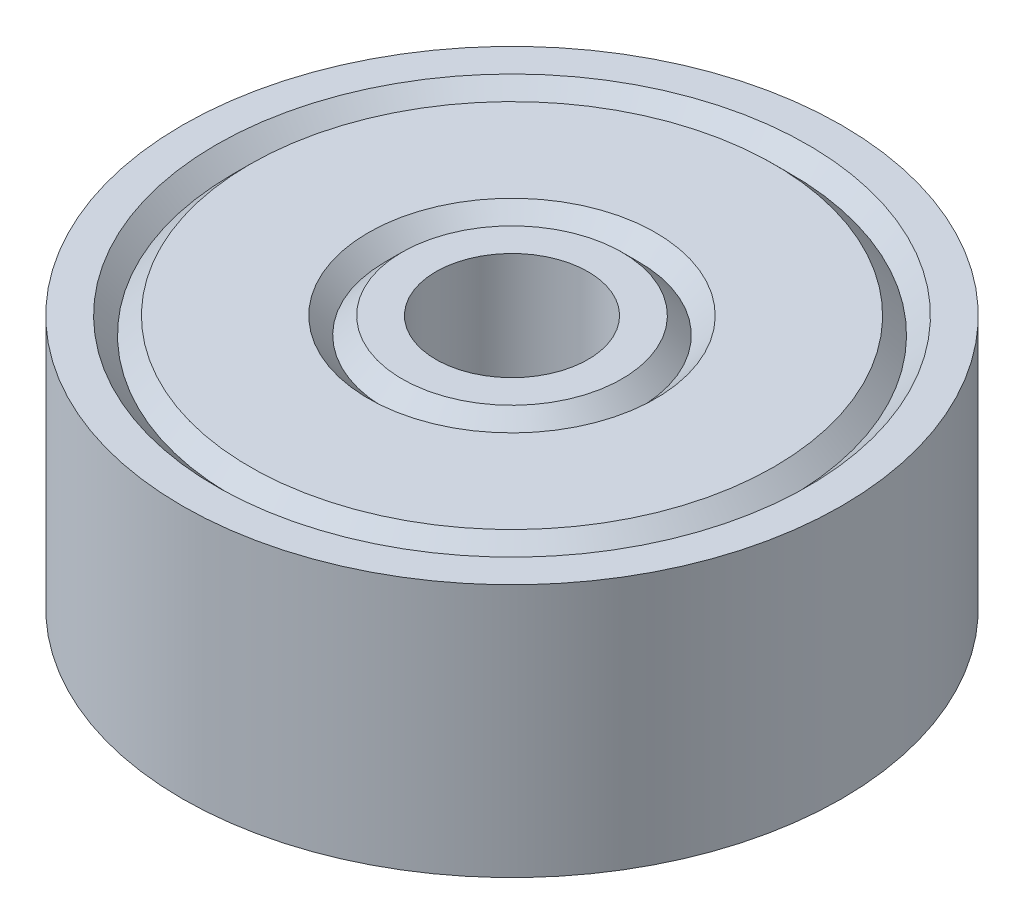
ISO-10303-21;
HEADER;
FILE_DESCRIPTION(('STEP AP214'),'2;1');
FILE_NAME('part.step','',(''),(''),'','','');
FILE_SCHEMA(('AUTOMOTIVE_DESIGN { 1 0 10303 214 1 1 1 1 }'));
ENDSEC;
DATA;
#1=APPLICATION_CONTEXT('core data for automotive mechanical design processes');
#2=APPLICATION_PROTOCOL_DEFINITION('international standard','automotive_design',2000,#1);
#3=PRODUCT_CONTEXT('',#1,'mechanical');
#4=PRODUCT('Part','Part','',(#3));
#5=PRODUCT_RELATED_PRODUCT_CATEGORY('part','',(#4));
#6=PRODUCT_DEFINITION_FORMATION('','',#4);
#7=PRODUCT_DEFINITION_CONTEXT('part definition',#1,'design');
#8=PRODUCT_DEFINITION('design','',#6,#7);
#9=PRODUCT_DEFINITION_SHAPE('','',#8);
#10=(LENGTH_UNIT() NAMED_UNIT(*) SI_UNIT(.MILLI.,.METRE.));
#11=(NAMED_UNIT(*) PLANE_ANGLE_UNIT() SI_UNIT($,.RADIAN.));
#12=(NAMED_UNIT(*) SI_UNIT($,.STERADIAN.) SOLID_ANGLE_UNIT());
#13=UNCERTAINTY_MEASURE_WITH_UNIT(LENGTH_MEASURE(1.E-05),#10,'distance_accuracy_value','');
#14=(GEOMETRIC_REPRESENTATION_CONTEXT(3) GLOBAL_UNCERTAINTY_ASSIGNED_CONTEXT((#13)) GLOBAL_UNIT_ASSIGNED_CONTEXT((#10,
#11,#12)) REPRESENTATION_CONTEXT('',''));
#15=CARTESIAN_POINT('',(0.,0.,0.));
#16=DIRECTION('',(0.,0.,1.));
#17=DIRECTION('',(1.,0.,0.));
#18=AXIS2_PLACEMENT_3D('',#15,#16,#17);
#19=CARTESIAN_POINT('',(0.,2.5,0.));
#20=DIRECTION('',(0.,1.,0.));
#21=DIRECTION('',(-1.,0.,0.));
#22=AXIS2_PLACEMENT_3D('',#19,#20,#21);
#23=CYLINDRICAL_SURFACE('',#22,1.5);
#24=CARTESIAN_POINT('',(0.,2.5,0.));
#25=DIRECTION('',(0.,1.,0.));
#26=DIRECTION('',(-1.,0.,0.));
#27=AXIS2_PLACEMENT_3D('',#24,#25,#26);
#28=CIRCLE('',#27,1.5);
#29=CARTESIAN_POINT('',(-1.5,2.5,0.));
#30=VERTEX_POINT('',#29);
#31=EDGE_CURVE('E83',#30,#30,#28,.T.);
#32=ORIENTED_EDGE('',*,*,#31,.T.);
#33=EDGE_LOOP('',(#32));
#34=FACE_BOUND('',#33,.T.);
#35=CARTESIAN_POINT('',(0.,-2.5,0.));
#36=DIRECTION('',(0.,1.,0.));
#37=DIRECTION('',(-1.,0.,0.));
#38=AXIS2_PLACEMENT_3D('',#35,#36,#37);
#39=CIRCLE('',#38,1.5);
#40=CARTESIAN_POINT('',(-1.5,-2.5,0.));
#41=VERTEX_POINT('',#40);
#42=EDGE_CURVE('E10',#41,#41,#39,.T.);
#43=ORIENTED_EDGE('',*,*,#42,.F.);
#44=EDGE_LOOP('',(#43));
#45=FACE_BOUND('',#44,.T.);
#46=ADVANCED_FACE('F31',(#34,#45),#23,.F.);
#47=CARTESIAN_POINT('',(-1.5,-2.5,0.));
#48=DIRECTION('',(0.,-1.,0.));
#49=DIRECTION('',(1.,0.,0.));
#50=AXIS2_PLACEMENT_3D('',#47,#48,#49);
#51=PLANE('',#50);
#52=ORIENTED_EDGE('',*,*,#42,.T.);
#53=EDGE_LOOP('',(#52));
#54=FACE_BOUND('',#53,.T.);
#55=CARTESIAN_POINT('',(0.,-2.5,0.));
#56=DIRECTION('',(0.,1.,0.));
#57=DIRECTION('',(-1.,0.,0.));
#58=AXIS2_PLACEMENT_3D('',#55,#56,#57);
#59=CIRCLE('',#58,2.16666666666667);
#60=CARTESIAN_POINT('',(-2.16666666666667,-2.5,0.));
#61=VERTEX_POINT('',#60);
#62=EDGE_CURVE('E37',#61,#61,#59,.T.);
#63=ORIENTED_EDGE('',*,*,#62,.F.);
#64=EDGE_LOOP('',(#63));
#65=FACE_BOUND('',#64,.T.);
#66=ADVANCED_FACE('F101',(#54,#65),#51,.T.);
#67=CARTESIAN_POINT('',(0.,-2.16666666666667,0.));
#68=DIRECTION('',(0.,1.,0.));
#69=DIRECTION('',(-1.,0.,0.));
#70=AXIS2_PLACEMENT_3D('',#67,#68,#69);
#71=CONICAL_SURFACE('',#70,2.5,0.785398163397448);
#72=ORIENTED_EDGE('',*,*,#62,.T.);
#73=EDGE_LOOP('',(#72));
#74=FACE_BOUND('',#73,.T.);
#75=CARTESIAN_POINT('',(0.,-2.16666666666667,0.));
#76=DIRECTION('',(0.,1.,0.));
#77=DIRECTION('',(-1.,0.,0.));
#78=AXIS2_PLACEMENT_3D('',#75,#76,#77);
#79=CIRCLE('',#78,2.5);
#80=CARTESIAN_POINT('',(-2.5,-2.16666666666667,0.));
#81=VERTEX_POINT('',#80);
#82=EDGE_CURVE('E41',#81,#81,#79,.T.);
#83=ORIENTED_EDGE('',*,*,#82,.F.);
#84=EDGE_LOOP('',(#83));
#85=FACE_BOUND('',#84,.T.);
#86=ADVANCED_FACE('F105',(#74,#85),#71,.T.);
#87=CARTESIAN_POINT('',(0.,-2.5,0.));
#88=DIRECTION('',(0.,-1.,0.));
#89=DIRECTION('',(1.,0.,0.));
#90=AXIS2_PLACEMENT_3D('',#87,#88,#89);
#91=CONICAL_SURFACE('',#90,2.83333333333333,0.785398163397449);
#92=ORIENTED_EDGE('',*,*,#82,.T.);
#93=EDGE_LOOP('',(#92));
#94=FACE_BOUND('',#93,.T.);
#95=CARTESIAN_POINT('',(0.,-2.5,0.));
#96=DIRECTION('',(0.,1.,0.));
#97=DIRECTION('',(-1.,0.,0.));
#98=AXIS2_PLACEMENT_3D('',#95,#96,#97);
#99=CIRCLE('',#98,2.83333333333333);
#100=CARTESIAN_POINT('',(-2.83333333333333,-2.5,0.));
#101=VERTEX_POINT('',#100);
#102=EDGE_CURVE('E45',#101,#101,#99,.T.);
#103=ORIENTED_EDGE('',*,*,#102,.F.);
#104=EDGE_LOOP('',(#103));
#105=FACE_BOUND('',#104,.T.);
#106=ADVANCED_FACE('F109',(#94,#105),#91,.F.);
#107=CARTESIAN_POINT('',(-2.83333333333333,-2.5,0.));
#108=DIRECTION('',(0.,-1.,0.));
#109=DIRECTION('',(1.,0.,0.));
#110=AXIS2_PLACEMENT_3D('',#107,#108,#109);
#111=PLANE('',#110);
#112=ORIENTED_EDGE('',*,*,#102,.T.);
#113=EDGE_LOOP('',(#112));
#114=FACE_BOUND('',#113,.T.);
#115=CARTESIAN_POINT('',(0.,-2.5,0.));
#116=DIRECTION('',(0.,1.,0.));
#117=DIRECTION('',(-1.,0.,0.));
#118=AXIS2_PLACEMENT_3D('',#115,#116,#117);
#119=CIRCLE('',#118,5.16666666666667);
#120=CARTESIAN_POINT('',(-5.16666666666667,-2.5,0.));
#121=VERTEX_POINT('',#120);
#122=EDGE_CURVE('E50',#121,#121,#119,.T.);
#123=ORIENTED_EDGE('',*,*,#122,.F.);
#124=EDGE_LOOP('',(#123));
#125=FACE_BOUND('',#124,.T.);
#126=ADVANCED_FACE('F115',(#114,#125),#111,.T.);
#127=CARTESIAN_POINT('',(0.,-2.16666666666667,0.));
#128=DIRECTION('',(0.,1.,0.));
#129=DIRECTION('',(-1.,0.,0.));
#130=AXIS2_PLACEMENT_3D('',#127,#128,#129);
#131=CONICAL_SURFACE('',#130,5.5,0.78539816339745);
#132=ORIENTED_EDGE('',*,*,#122,.T.);
#133=EDGE_LOOP('',(#132));
#134=FACE_BOUND('',#133,.T.);
#135=CARTESIAN_POINT('',(0.,-2.16666666666667,0.));
#136=DIRECTION('',(0.,1.,0.));
#137=DIRECTION('',(-1.,0.,0.));
#138=AXIS2_PLACEMENT_3D('',#135,#136,#137);
#139=CIRCLE('',#138,5.5);
#140=CARTESIAN_POINT('',(-5.5,-2.16666666666667,0.));
#141=VERTEX_POINT('',#140);
#142=EDGE_CURVE('E53',#141,#141,#139,.T.);
#143=ORIENTED_EDGE('',*,*,#142,.F.);
#144=EDGE_LOOP('',(#143));
#145=FACE_BOUND('',#144,.T.);
#146=ADVANCED_FACE('F119',(#134,#145),#131,.T.);
#147=CARTESIAN_POINT('',(0.,-2.5,0.));
#148=DIRECTION('',(0.,-1.,0.));
#149=DIRECTION('',(1.,0.,0.));
#150=AXIS2_PLACEMENT_3D('',#147,#148,#149);
#151=CONICAL_SURFACE('',#150,5.83333333333333,0.785398163397447);
#152=ORIENTED_EDGE('',*,*,#142,.T.);
#153=EDGE_LOOP('',(#152));
#154=FACE_BOUND('',#153,.T.);
#155=CARTESIAN_POINT('',(0.,-2.5,0.));
#156=DIRECTION('',(0.,1.,0.));
#157=DIRECTION('',(-1.,0.,0.));
#158=AXIS2_PLACEMENT_3D('',#155,#156,#157);
#159=CIRCLE('',#158,5.83333333333333);
#160=CARTESIAN_POINT('',(-5.83333333333333,-2.5,0.));
#161=VERTEX_POINT('',#160);
#162=EDGE_CURVE('E56',#161,#161,#159,.T.);
#163=ORIENTED_EDGE('',*,*,#162,.F.);
#164=EDGE_LOOP('',(#163));
#165=FACE_BOUND('',#164,.T.);
#166=ADVANCED_FACE('F123',(#154,#165),#151,.F.);
#167=CARTESIAN_POINT('',(-5.83333333333333,-2.5,0.));
#168=DIRECTION('',(0.,-1.,0.));
#169=DIRECTION('',(1.,0.,0.));
#170=AXIS2_PLACEMENT_3D('',#167,#168,#169);
#171=PLANE('',#170);
#172=ORIENTED_EDGE('',*,*,#162,.T.);
#173=EDGE_LOOP('',(#172));
#174=FACE_BOUND('',#173,.T.);
#175=CARTESIAN_POINT('',(0.,-2.5,0.));
#176=DIRECTION('',(0.,1.,0.));
#177=DIRECTION('',(-1.,0.,0.));
#178=AXIS2_PLACEMENT_3D('',#175,#176,#177);
#179=CIRCLE('',#178,6.5);
#180=CARTESIAN_POINT('',(-6.5,-2.5,0.));
#181=VERTEX_POINT('',#180);
#182=EDGE_CURVE('E59',#181,#181,#179,.T.);
#183=ORIENTED_EDGE('',*,*,#182,.F.);
#184=EDGE_LOOP('',(#183));
#185=FACE_BOUND('',#184,.T.);
#186=ADVANCED_FACE('F127',(#174,#185),#171,.T.);
#187=CARTESIAN_POINT('',(0.,2.5,0.));
#188=DIRECTION('',(0.,1.,0.));
#189=DIRECTION('',(-1.,0.,0.));
#190=AXIS2_PLACEMENT_3D('',#187,#188,#189);
#191=CYLINDRICAL_SURFACE('',#190,6.5);
#192=ORIENTED_EDGE('',*,*,#182,.T.);
#193=EDGE_LOOP('',(#192));
#194=FACE_BOUND('',#193,.T.);
#195=CARTESIAN_POINT('',(0.,2.5,0.));
#196=DIRECTION('',(0.,1.,0.));
#197=DIRECTION('',(-1.,0.,0.));
#198=AXIS2_PLACEMENT_3D('',#195,#196,#197);
#199=CIRCLE('',#198,6.5);
#200=CARTESIAN_POINT('',(-6.5,2.5,0.));
#201=VERTEX_POINT('',#200);
#202=EDGE_CURVE('E62',#201,#201,#199,.T.);
#203=ORIENTED_EDGE('',*,*,#202,.F.);
#204=EDGE_LOOP('',(#203));
#205=FACE_BOUND('',#204,.T.);
#206=ADVANCED_FACE('F131',(#194,#205),#191,.T.);
#207=CARTESIAN_POINT('',(-5.83333333333333,2.5,0.));
#208=DIRECTION('',(0.,1.,0.));
#209=DIRECTION('',(-1.,0.,0.));
#210=AXIS2_PLACEMENT_3D('',#207,#208,#209);
#211=PLANE('',#210);
#212=ORIENTED_EDGE('',*,*,#202,.T.);
#213=EDGE_LOOP('',(#212));
#214=FACE_BOUND('',#213,.T.);
#215=CARTESIAN_POINT('',(0.,2.5,0.));
#216=DIRECTION('',(0.,1.,0.));
#217=DIRECTION('',(-1.,0.,0.));
#218=AXIS2_PLACEMENT_3D('',#215,#216,#217);
#219=CIRCLE('',#218,5.83333333333333);
#220=CARTESIAN_POINT('',(-5.83333333333333,2.5,0.));
#221=VERTEX_POINT('',#220);
#222=EDGE_CURVE('E65',#221,#221,#219,.T.);
#223=ORIENTED_EDGE('',*,*,#222,.F.);
#224=EDGE_LOOP('',(#223));
#225=FACE_BOUND('',#224,.T.);
#226=ADVANCED_FACE('F135',(#214,#225),#211,.T.);
#227=CARTESIAN_POINT('',(0.,2.16666666666667,0.));
#228=DIRECTION('',(0.,1.,0.));
#229=DIRECTION('',(-1.,0.,0.));
#230=AXIS2_PLACEMENT_3D('',#227,#228,#229);
#231=CONICAL_SURFACE('',#230,5.5,0.785398163397452);
#232=ORIENTED_EDGE('',*,*,#222,.T.);
#233=EDGE_LOOP('',(#232));
#234=FACE_BOUND('',#233,.T.);
#235=CARTESIAN_POINT('',(0.,2.16666666666667,0.));
#236=DIRECTION('',(0.,1.,0.));
#237=DIRECTION('',(-1.,0.,0.));
#238=AXIS2_PLACEMENT_3D('',#235,#236,#237);
#239=CIRCLE('',#238,5.5);
#240=CARTESIAN_POINT('',(-5.5,2.16666666666667,0.));
#241=VERTEX_POINT('',#240);
#242=EDGE_CURVE('E68',#241,#241,#239,.T.);
#243=ORIENTED_EDGE('',*,*,#242,.F.);
#244=EDGE_LOOP('',(#243));
#245=FACE_BOUND('',#244,.T.);
#246=ADVANCED_FACE('F139',(#234,#245),#231,.F.);
#247=CARTESIAN_POINT('',(0.,2.5,0.));
#248=DIRECTION('',(0.,-1.,0.));
#249=DIRECTION('',(1.,0.,0.));
#250=AXIS2_PLACEMENT_3D('',#247,#248,#249);
#251=CONICAL_SURFACE('',#250,5.16666666666667,0.785398163397448);
#252=ORIENTED_EDGE('',*,*,#242,.T.);
#253=EDGE_LOOP('',(#252));
#254=FACE_BOUND('',#253,.T.);
#255=CARTESIAN_POINT('',(0.,2.5,0.));
#256=DIRECTION('',(0.,1.,0.));
#257=DIRECTION('',(-1.,0.,0.));
#258=AXIS2_PLACEMENT_3D('',#255,#256,#257);
#259=CIRCLE('',#258,5.16666666666667);
#260=CARTESIAN_POINT('',(-5.16666666666667,2.5,0.));
#261=VERTEX_POINT('',#260);
#262=EDGE_CURVE('E71',#261,#261,#259,.T.);
#263=ORIENTED_EDGE('',*,*,#262,.F.);
#264=EDGE_LOOP('',(#263));
#265=FACE_BOUND('',#264,.T.);
#266=ADVANCED_FACE('F143',(#254,#265),#251,.T.);
#267=CARTESIAN_POINT('',(-2.83333333333333,2.5,0.));
#268=DIRECTION('',(0.,1.,0.));
#269=DIRECTION('',(-1.,0.,0.));
#270=AXIS2_PLACEMENT_3D('',#267,#268,#269);
#271=PLANE('',#270);
#272=ORIENTED_EDGE('',*,*,#262,.T.);
#273=EDGE_LOOP('',(#272));
#274=FACE_BOUND('',#273,.T.);
#275=CARTESIAN_POINT('',(0.,2.5,0.));
#276=DIRECTION('',(0.,1.,0.));
#277=DIRECTION('',(-1.,0.,0.));
#278=AXIS2_PLACEMENT_3D('',#275,#276,#277);
#279=CIRCLE('',#278,2.83333333333333);
#280=CARTESIAN_POINT('',(-2.83333333333333,2.5,0.));
#281=VERTEX_POINT('',#280);
#282=EDGE_CURVE('E74',#281,#281,#279,.T.);
#283=ORIENTED_EDGE('',*,*,#282,.F.);
#284=EDGE_LOOP('',(#283));
#285=FACE_BOUND('',#284,.T.);
#286=ADVANCED_FACE('F147',(#274,#285),#271,.T.);
#287=CARTESIAN_POINT('',(0.,2.16666666666667,0.));
#288=DIRECTION('',(0.,1.,0.));
#289=DIRECTION('',(-1.,0.,0.));
#290=AXIS2_PLACEMENT_3D('',#287,#288,#289);
#291=CONICAL_SURFACE('',#290,2.5,0.785398163397447);
#292=ORIENTED_EDGE('',*,*,#282,.T.);
#293=EDGE_LOOP('',(#292));
#294=FACE_BOUND('',#293,.T.);
#295=CARTESIAN_POINT('',(0.,2.16666666666667,0.));
#296=DIRECTION('',(0.,1.,0.));
#297=DIRECTION('',(-1.,0.,0.));
#298=AXIS2_PLACEMENT_3D('',#295,#296,#297);
#299=CIRCLE('',#298,2.5);
#300=CARTESIAN_POINT('',(-2.5,2.16666666666667,0.));
#301=VERTEX_POINT('',#300);
#302=EDGE_CURVE('E77',#301,#301,#299,.T.);
#303=ORIENTED_EDGE('',*,*,#302,.F.);
#304=EDGE_LOOP('',(#303));
#305=FACE_BOUND('',#304,.T.);
#306=ADVANCED_FACE('F97',(#294,#305),#291,.F.);
#307=CARTESIAN_POINT('',(0.,2.5,0.));
#308=DIRECTION('',(0.,-1.,0.));
#309=DIRECTION('',(1.,0.,0.));
#310=AXIS2_PLACEMENT_3D('',#307,#308,#309);
#311=CONICAL_SURFACE('',#310,2.16666666666667,0.785398163397448);
#312=ORIENTED_EDGE('',*,*,#302,.T.);
#313=EDGE_LOOP('',(#312));
#314=FACE_BOUND('',#313,.T.);
#315=CARTESIAN_POINT('',(0.,2.5,0.));
#316=DIRECTION('',(0.,1.,0.));
#317=DIRECTION('',(-1.,0.,0.));
#318=AXIS2_PLACEMENT_3D('',#315,#316,#317);
#319=CIRCLE('',#318,2.16666666666667);
#320=CARTESIAN_POINT('',(-2.16666666666667,2.5,0.));
#321=VERTEX_POINT('',#320);
#322=EDGE_CURVE('E80',#321,#321,#319,.T.);
#323=ORIENTED_EDGE('',*,*,#322,.F.);
#324=EDGE_LOOP('',(#323));
#325=FACE_BOUND('',#324,.T.);
#326=ADVANCED_FACE('F91',(#314,#325),#311,.T.);
#327=CARTESIAN_POINT('',(-1.5,2.5,0.));
#328=DIRECTION('',(0.,1.,0.));
#329=DIRECTION('',(-1.,0.,0.));
#330=AXIS2_PLACEMENT_3D('',#327,#328,#329);
#331=PLANE('',#330);
#332=ORIENTED_EDGE('',*,*,#322,.T.);
#333=EDGE_LOOP('',(#332));
#334=FACE_BOUND('',#333,.T.);
#335=ORIENTED_EDGE('',*,*,#31,.F.);
#336=EDGE_LOOP('',(#335));
#337=FACE_BOUND('',#336,.T.);
#338=ADVANCED_FACE('F89',(#334,#337),#331,.T.);
#339=CLOSED_SHELL('',(#46,#66,#86,#106,#126,#146,#166,#186,#206,#226,#246,#266,#286,#306,#326,#338));
#340=MANIFOLD_SOLID_BREP('B2',#339);
#341=ADVANCED_BREP_SHAPE_REPRESENTATION('',(#18,#340),#14);
#342=SHAPE_DEFINITION_REPRESENTATION(#9,#341);
ENDSEC;
END-ISO-10303-21;
